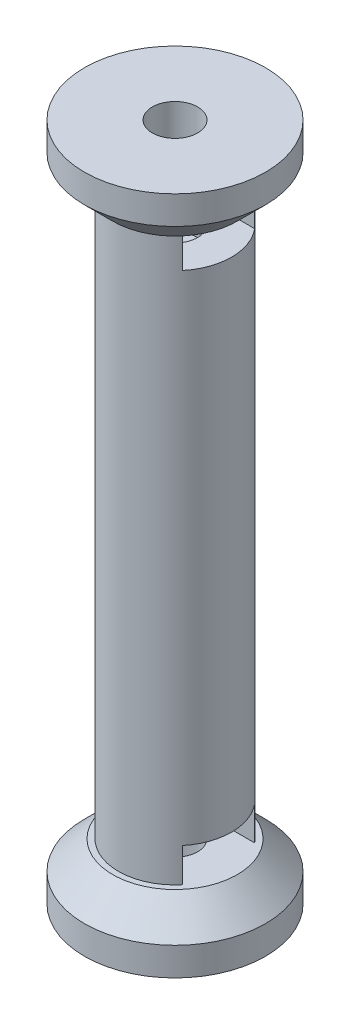
ISO-10303-21;
HEADER;
FILE_DESCRIPTION(('STEP AP214'),'2;1');
FILE_NAME('part.step','',(''),(''),'','','');
FILE_SCHEMA(('AUTOMOTIVE_DESIGN { 1 0 10303 214 1 1 1 1 }'));
ENDSEC;
DATA;
#1=APPLICATION_CONTEXT('core data for automotive mechanical design processes');
#2=APPLICATION_PROTOCOL_DEFINITION('international standard','automotive_design',2000,#1);
#3=PRODUCT_CONTEXT('',#1,'mechanical');
#4=PRODUCT('Part','Part','',(#3));
#5=PRODUCT_RELATED_PRODUCT_CATEGORY('part','',(#4));
#6=PRODUCT_DEFINITION_FORMATION('','',#4);
#7=PRODUCT_DEFINITION_CONTEXT('part definition',#1,'design');
#8=PRODUCT_DEFINITION('design','',#6,#7);
#9=PRODUCT_DEFINITION_SHAPE('','',#8);
#10=(LENGTH_UNIT() NAMED_UNIT(*) SI_UNIT(.MILLI.,.METRE.));
#11=(NAMED_UNIT(*) PLANE_ANGLE_UNIT() SI_UNIT($,.RADIAN.));
#12=(NAMED_UNIT(*) SI_UNIT($,.STERADIAN.) SOLID_ANGLE_UNIT());
#13=UNCERTAINTY_MEASURE_WITH_UNIT(LENGTH_MEASURE(1.E-05),#10,'distance_accuracy_value','');
#14=(GEOMETRIC_REPRESENTATION_CONTEXT(3) GLOBAL_UNCERTAINTY_ASSIGNED_CONTEXT((#13)) GLOBAL_UNIT_ASSIGNED_CONTEXT((#10,
#11,#12)) REPRESENTATION_CONTEXT('',''));
#15=CARTESIAN_POINT('',(0.,0.,0.));
#16=DIRECTION('',(0.,0.,1.));
#17=DIRECTION('',(1.,0.,0.));
#18=AXIS2_PLACEMENT_3D('',#15,#16,#17);
#19=CARTESIAN_POINT('',(0.,25.,0.));
#20=DIRECTION('',(0.,-1.,0.));
#21=DIRECTION('',(0.,0.,-1.));
#22=AXIS2_PLACEMENT_3D('',#19,#20,#21);
#23=CYLINDRICAL_SURFACE('',#22,5.);
#24=CARTESIAN_POINT('',(0.,-25.,0.));
#25=DIRECTION('',(0.,1.,0.));
#26=DIRECTION('',(0.,0.,1.));
#27=AXIS2_PLACEMENT_3D('',#24,#25,#26);
#28=CIRCLE('',#27,5.);
#29=CARTESIAN_POINT('',(3.84187454245971,-25.,-3.2));
#30=VERTEX_POINT('',#29);
#31=CARTESIAN_POINT('',(3.84187454245971,-25.,3.2));
#32=VERTEX_POINT('',#31);
#33=EDGE_CURVE('E153',#30,#32,#28,.T.);
#34=ORIENTED_EDGE('',*,*,#33,.T.);
#35=DIRECTION('',(0.,-1.,0.));
#36=VECTOR('',#35,1.);
#37=CARTESIAN_POINT('',(3.84187454245971,25.,3.2));
#38=LINE('',#37,#36);
#39=CARTESIAN_POINT('',(3.84187454245971,-22.,3.2));
#40=VERTEX_POINT('',#39);
#41=EDGE_CURVE('E156',#32,#40,#38,.F.);
#42=ORIENTED_EDGE('',*,*,#41,.T.);
#43=CARTESIAN_POINT('',(0.,-22.,0.));
#44=DIRECTION('',(0.,-1.,0.));
#45=DIRECTION('',(0.,0.,-1.));
#46=AXIS2_PLACEMENT_3D('',#43,#44,#45);
#47=CIRCLE('',#46,5.);
#48=CARTESIAN_POINT('',(3.84187454245971,-22.,-3.2));
#49=VERTEX_POINT('',#48);
#50=EDGE_CURVE('E154',#49,#40,#47,.T.);
#51=ORIENTED_EDGE('',*,*,#50,.F.);
#52=DIRECTION('',(0.,-1.,0.));
#53=VECTOR('',#52,1.);
#54=CARTESIAN_POINT('',(3.84187454245971,25.,-3.2));
#55=LINE('',#54,#53);
#56=EDGE_CURVE('E140',#49,#30,#55,.T.);
#57=ORIENTED_EDGE('',*,*,#56,.T.);
#58=EDGE_LOOP('',(#34,#42,#51,#57));
#59=FACE_BOUND('',#58,.T.);
#60=DIRECTION('',(0.,-1.,0.));
#61=VECTOR('',#60,1.);
#62=CARTESIAN_POINT('',(3.84187454245971,25.,-3.2));
#63=LINE('',#62,#61);
#64=CARTESIAN_POINT('',(3.84187454245971,22.,-3.2));
#65=VERTEX_POINT('',#64);
#66=CARTESIAN_POINT('',(3.84187454245971,25.,-3.2));
#67=VERTEX_POINT('',#66);
#68=EDGE_CURVE('E310',#65,#67,#63,.F.);
#69=ORIENTED_EDGE('',*,*,#68,.F.);
#70=CARTESIAN_POINT('',(0.,22.,0.));
#71=DIRECTION('',(0.,1.,0.));
#72=DIRECTION('',(0.,0.,1.));
#73=AXIS2_PLACEMENT_3D('',#70,#71,#72);
#74=CIRCLE('',#73,5.);
#75=CARTESIAN_POINT('',(3.84187454245971,22.,3.2));
#76=VERTEX_POINT('',#75);
#77=EDGE_CURVE('E196',#76,#65,#74,.T.);
#78=ORIENTED_EDGE('',*,*,#77,.F.);
#79=DIRECTION('',(0.,-1.,0.));
#80=VECTOR('',#79,1.);
#81=CARTESIAN_POINT('',(3.84187454245971,25.,3.2));
#82=LINE('',#81,#80);
#83=CARTESIAN_POINT('',(3.84187454245971,25.,3.2));
#84=VERTEX_POINT('',#83);
#85=EDGE_CURVE('E307',#84,#76,#82,.T.);
#86=ORIENTED_EDGE('',*,*,#85,.F.);
#87=CARTESIAN_POINT('',(0.,25.,0.));
#88=DIRECTION('',(0.,1.,0.));
#89=DIRECTION('',(0.,0.,1.));
#90=AXIS2_PLACEMENT_3D('',#87,#88,#89);
#91=CIRCLE('',#90,5.);
#92=EDGE_CURVE('E176',#67,#84,#91,.T.);
#93=ORIENTED_EDGE('',*,*,#92,.F.);
#94=EDGE_LOOP('',(#69,#78,#86,#93));
#95=FACE_BOUND('',#94,.T.);
#96=ADVANCED_FACE('F43',(#59,#95),#23,.T.);
#97=CARTESIAN_POINT('',(0.,30.,0.));
#98=DIRECTION('',(0.,-1.,0.));
#99=DIRECTION('',(0.,0.,-1.));
#100=AXIS2_PLACEMENT_3D('',#97,#98,#99);
#101=CYLINDRICAL_SURFACE('',#100,8.);
#102=CARTESIAN_POINT('',(0.,27.5,0.));
#103=DIRECTION('',(0.,1.,0.));
#104=DIRECTION('',(0.,0.,1.));
#105=AXIS2_PLACEMENT_3D('',#102,#103,#104);
#106=CIRCLE('',#105,8.);
#107=CARTESIAN_POINT('',(0.,27.5,8.));
#108=VERTEX_POINT('',#107);
#109=EDGE_CURVE('E178',#108,#108,#106,.T.);
#110=ORIENTED_EDGE('',*,*,#109,.T.);
#111=EDGE_LOOP('',(#110));
#112=FACE_BOUND('',#111,.T.);
#113=CARTESIAN_POINT('',(0.,30.,0.));
#114=DIRECTION('',(0.,1.,0.));
#115=DIRECTION('',(0.,0.,1.));
#116=AXIS2_PLACEMENT_3D('',#113,#114,#115);
#117=CIRCLE('',#116,8.);
#118=CARTESIAN_POINT('',(0.,30.,8.));
#119=VERTEX_POINT('',#118);
#120=EDGE_CURVE('E319',#119,#119,#117,.T.);
#121=ORIENTED_EDGE('',*,*,#120,.F.);
#122=EDGE_LOOP('',(#121));
#123=FACE_BOUND('',#122,.T.);
#124=ADVANCED_FACE('F372',(#112,#123),#101,.T.);
#125=CARTESIAN_POINT('',(0.,30.,0.));
#126=DIRECTION('',(0.,1.,0.));
#127=DIRECTION('',(0.,0.,1.));
#128=AXIS2_PLACEMENT_3D('',#125,#126,#127);
#129=PLANE('',#128);
#130=CARTESIAN_POINT('',(0.,30.,0.));
#131=DIRECTION('',(0.,1.,0.));
#132=DIRECTION('',(0.,0.,1.));
#133=AXIS2_PLACEMENT_3D('',#130,#131,#132);
#134=CIRCLE('',#133,2.);
#135=CARTESIAN_POINT('',(0.,30.,2.));
#136=VERTEX_POINT('',#135);
#137=EDGE_CURVE('E314',#136,#136,#134,.T.);
#138=ORIENTED_EDGE('',*,*,#137,.F.);
#139=EDGE_LOOP('',(#138));
#140=FACE_BOUND('',#139,.T.);
#141=ORIENTED_EDGE('',*,*,#120,.T.);
#142=EDGE_LOOP('',(#141));
#143=FACE_BOUND('',#142,.T.);
#144=ADVANCED_FACE('F377',(#140,#143),#129,.T.);
#145=CARTESIAN_POINT('',(0.,25.,0.));
#146=DIRECTION('',(0.,1.,0.));
#147=DIRECTION('',(0.,0.,1.));
#148=AXIS2_PLACEMENT_3D('',#145,#146,#147);
#149=PLANE('',#148);
#150=CARTESIAN_POINT('',(0.,25.,0.));
#151=DIRECTION('',(0.,1.,0.));
#152=DIRECTION('',(0.,0.,1.));
#153=AXIS2_PLACEMENT_3D('',#150,#151,#152);
#154=CIRCLE('',#153,5.49999999999998);
#155=CARTESIAN_POINT('',(0.,25.,5.49999999999998));
#156=VERTEX_POINT('',#155);
#157=EDGE_CURVE('E182',#156,#156,#154,.F.);
#158=ORIENTED_EDGE('',*,*,#157,.T.);
#159=EDGE_LOOP('',(#158));
#160=FACE_BOUND('',#159,.T.);
#161=DIRECTION('',(-1.,0.,0.));
#162=VECTOR('',#161,1.);
#163=CARTESIAN_POINT('',(-3.5,25.,3.2));
#164=LINE('',#163,#162);
#165=CARTESIAN_POINT('',(-2.49999999999999,25.,3.2));
#166=VERTEX_POINT('',#165);
#167=EDGE_CURVE('E293',#84,#166,#164,.T.);
#168=ORIENTED_EDGE('',*,*,#167,.T.);
#169=DIRECTION('',(0.707106781186552,0.,0.707106781186543));
#170=VECTOR('',#169,1.);
#171=CARTESIAN_POINT('',(-2.49999999999999,25.,3.2));
#172=LINE('',#171,#170);
#173=CARTESIAN_POINT('',(-3.5,25.,2.2));
#174=VERTEX_POINT('',#173);
#175=EDGE_CURVE('E203',#166,#174,#172,.F.);
#176=ORIENTED_EDGE('',*,*,#175,.T.);
#177=DIRECTION('',(0.,0.,-1.));
#178=VECTOR('',#177,1.);
#179=CARTESIAN_POINT('',(-3.5,25.,-3.2));
#180=LINE('',#179,#178);
#181=CARTESIAN_POINT('',(-3.5,25.,-2.19999999999999));
#182=VERTEX_POINT('',#181);
#183=EDGE_CURVE('E163',#174,#182,#180,.T.);
#184=ORIENTED_EDGE('',*,*,#183,.T.);
#185=DIRECTION('',(-0.707106781186545,0.,0.70710678118655));
#186=VECTOR('',#185,1.);
#187=CARTESIAN_POINT('',(-3.5,25.,-2.19999999999999));
#188=LINE('',#187,#186);
#189=CARTESIAN_POINT('',(-2.5,25.,-3.2));
#190=VERTEX_POINT('',#189);
#191=EDGE_CURVE('E200',#182,#190,#188,.F.);
#192=ORIENTED_EDGE('',*,*,#191,.T.);
#193=DIRECTION('',(1.,0.,0.));
#194=VECTOR('',#193,1.);
#195=CARTESIAN_POINT('',(-3.5,25.,-3.2));
#196=LINE('',#195,#194);
#197=EDGE_CURVE('E169',#190,#67,#196,.T.);
#198=ORIENTED_EDGE('',*,*,#197,.T.);
#199=ORIENTED_EDGE('',*,*,#92,.T.);
#200=EDGE_LOOP('',(#168,#176,#184,#192,#198,#199));
#201=FACE_BOUND('',#200,.T.);
#202=CARTESIAN_POINT('',(0.,25.,0.));
#203=DIRECTION('',(0.,1.,0.));
#204=DIRECTION('',(0.,0.,1.));
#205=AXIS2_PLACEMENT_3D('',#202,#203,#204);
#206=CIRCLE('',#205,2.);
#207=CARTESIAN_POINT('',(0.,25.,2.));
#208=VERTEX_POINT('',#207);
#209=EDGE_CURVE('E187',#208,#208,#206,.F.);
#210=ORIENTED_EDGE('',*,*,#209,.F.);
#211=EDGE_LOOP('',(#210));
#212=FACE_BOUND('',#211,.T.);
#213=ADVANCED_FACE('F330',(#160,#201,#212),#149,.F.);
#214=CARTESIAN_POINT('',(0.,27.5,0.));
#215=DIRECTION('',(0.,1.,0.));
#216=DIRECTION('',(0.,0.,1.));
#217=AXIS2_PLACEMENT_3D('',#214,#215,#216);
#218=CONICAL_SURFACE('',#217,8.,0.785398163397452);
#219=ORIENTED_EDGE('',*,*,#157,.F.);
#220=EDGE_LOOP('',(#219));
#221=FACE_BOUND('',#220,.T.);
#222=ORIENTED_EDGE('',*,*,#109,.F.);
#223=EDGE_LOOP('',(#222));
#224=FACE_BOUND('',#223,.T.);
#225=ADVANCED_FACE('F366',(#221,#224),#218,.T.);
#226=CARTESIAN_POINT('',(0.,20.,0.));
#227=DIRECTION('',(0.,1.,0.));
#228=DIRECTION('',(0.,0.,1.));
#229=AXIS2_PLACEMENT_3D('',#226,#227,#228);
#230=CYLINDRICAL_SURFACE('',#229,2.);
#231=ORIENTED_EDGE('',*,*,#209,.T.);
#232=EDGE_LOOP('',(#231));
#233=FACE_BOUND('',#232,.T.);
#234=ORIENTED_EDGE('',*,*,#137,.T.);
#235=EDGE_LOOP('',(#234));
#236=FACE_BOUND('',#235,.T.);
#237=ADVANCED_FACE('F359',(#233,#236),#230,.F.);
#238=CARTESIAN_POINT('',(-3.5,22.,-3.2));
#239=DIRECTION('',(0.,0.,1.));
#240=DIRECTION('',(1.,0.,0.));
#241=AXIS2_PLACEMENT_3D('',#238,#239,#240);
#242=PLANE('',#241);
#243=ORIENTED_EDGE('',*,*,#197,.F.);
#244=DIRECTION('',(0.,-1.,0.));
#245=VECTOR('',#244,1.);
#246=CARTESIAN_POINT('',(-2.5,22.,-3.2));
#247=LINE('',#246,#245);
#248=CARTESIAN_POINT('',(-2.5,22.,-3.2));
#249=VERTEX_POINT('',#248);
#250=EDGE_CURVE('E219',#190,#249,#247,.T.);
#251=ORIENTED_EDGE('',*,*,#250,.T.);
#252=DIRECTION('',(1.,0.,0.));
#253=VECTOR('',#252,1.);
#254=CARTESIAN_POINT('',(-3.5,22.,-3.2));
#255=LINE('',#254,#253);
#256=EDGE_CURVE('E292',#249,#65,#255,.T.);
#257=ORIENTED_EDGE('',*,*,#256,.T.);
#258=ORIENTED_EDGE('',*,*,#68,.T.);
#259=EDGE_LOOP('',(#243,#251,#257,#258));
#260=FACE_BOUND('',#259,.T.);
#261=ADVANCED_FACE('F357',(#260),#242,.T.);
#262=CARTESIAN_POINT('',(-3.5,22.,3.2));
#263=DIRECTION('',(0.,0.,-1.));
#264=DIRECTION('',(-1.,0.,0.));
#265=AXIS2_PLACEMENT_3D('',#262,#263,#264);
#266=PLANE('',#265);
#267=DIRECTION('',(-1.,0.,0.));
#268=VECTOR('',#267,1.);
#269=CARTESIAN_POINT('',(-3.5,22.,3.2));
#270=LINE('',#269,#268);
#271=CARTESIAN_POINT('',(-2.49999999999999,22.,3.2));
#272=VERTEX_POINT('',#271);
#273=EDGE_CURVE('E192',#76,#272,#270,.T.);
#274=ORIENTED_EDGE('',*,*,#273,.T.);
#275=DIRECTION('',(0.,1.,0.));
#276=VECTOR('',#275,1.);
#277=CARTESIAN_POINT('',(-2.49999999999999,25.,3.2));
#278=LINE('',#277,#276);
#279=EDGE_CURVE('E186',#272,#166,#278,.T.);
#280=ORIENTED_EDGE('',*,*,#279,.T.);
#281=ORIENTED_EDGE('',*,*,#167,.F.);
#282=ORIENTED_EDGE('',*,*,#85,.T.);
#283=EDGE_LOOP('',(#274,#280,#281,#282));
#284=FACE_BOUND('',#283,.T.);
#285=ADVANCED_FACE('F338',(#284),#266,.T.);
#286=CARTESIAN_POINT('',(0.,22.,0.));
#287=DIRECTION('',(0.,1.,0.));
#288=DIRECTION('',(0.,0.,1.));
#289=AXIS2_PLACEMENT_3D('',#286,#287,#288);
#290=PLANE('',#289);
#291=CARTESIAN_POINT('',(0.,22.,0.));
#292=DIRECTION('',(0.,1.,0.));
#293=DIRECTION('',(0.,0.,1.));
#294=AXIS2_PLACEMENT_3D('',#291,#292,#293);
#295=CIRCLE('',#294,2.);
#296=CARTESIAN_POINT('',(0.,22.,2.));
#297=VERTEX_POINT('',#296);
#298=EDGE_CURVE('E191',#297,#297,#295,.F.);
#299=ORIENTED_EDGE('',*,*,#298,.T.);
#300=EDGE_LOOP('',(#299));
#301=FACE_BOUND('',#300,.T.);
#302=DIRECTION('',(0.,0.,-1.));
#303=VECTOR('',#302,1.);
#304=CARTESIAN_POINT('',(-3.5,22.,-3.2));
#305=LINE('',#304,#303);
#306=CARTESIAN_POINT('',(-3.5,22.,2.2));
#307=VERTEX_POINT('',#306);
#308=CARTESIAN_POINT('',(-3.5,22.,-2.19999999999999));
#309=VERTEX_POINT('',#308);
#310=EDGE_CURVE('E288',#307,#309,#305,.T.);
#311=ORIENTED_EDGE('',*,*,#310,.F.);
#312=DIRECTION('',(-0.707106781186552,0.,-0.707106781186543));
#313=VECTOR('',#312,1.);
#314=CARTESIAN_POINT('',(-2.84999999999998,22.,2.85000000000002));
#315=LINE('',#314,#313);
#316=EDGE_CURVE('E216',#307,#272,#315,.F.);
#317=ORIENTED_EDGE('',*,*,#316,.T.);
#318=ORIENTED_EDGE('',*,*,#273,.F.);
#319=ORIENTED_EDGE('',*,*,#77,.T.);
#320=ORIENTED_EDGE('',*,*,#256,.F.);
#321=DIRECTION('',(0.707106781186545,0.,-0.70710678118655));
#322=VECTOR('',#321,1.);
#323=CARTESIAN_POINT('',(-2.85000000000001,22.,-2.84999999999999));
#324=LINE('',#323,#322);
#325=EDGE_CURVE('E213',#249,#309,#324,.F.);
#326=ORIENTED_EDGE('',*,*,#325,.T.);
#327=EDGE_LOOP('',(#311,#317,#318,#319,#320,#326));
#328=FACE_BOUND('',#327,.T.);
#329=ADVANCED_FACE('F342',(#301,#328),#290,.T.);
#330=CARTESIAN_POINT('',(-3.5,22.,-3.2));
#331=DIRECTION('',(1.,0.,0.));
#332=DIRECTION('',(0.,0.,-1.));
#333=AXIS2_PLACEMENT_3D('',#330,#331,#332);
#334=PLANE('',#333);
#335=ORIENTED_EDGE('',*,*,#183,.F.);
#336=DIRECTION('',(0.,-1.,0.));
#337=VECTOR('',#336,1.);
#338=CARTESIAN_POINT('',(-3.5,22.,2.2));
#339=LINE('',#338,#337);
#340=EDGE_CURVE('E210',#174,#307,#339,.T.);
#341=ORIENTED_EDGE('',*,*,#340,.T.);
#342=ORIENTED_EDGE('',*,*,#310,.T.);
#343=DIRECTION('',(0.,1.,0.));
#344=VECTOR('',#343,1.);
#345=CARTESIAN_POINT('',(-3.5,25.,-2.19999999999999));
#346=LINE('',#345,#344);
#347=EDGE_CURVE('E206',#309,#182,#346,.T.);
#348=ORIENTED_EDGE('',*,*,#347,.T.);
#349=EDGE_LOOP('',(#335,#341,#342,#348));
#350=FACE_BOUND('',#349,.T.);
#351=ADVANCED_FACE('F350',(#350),#334,.T.);
#352=CARTESIAN_POINT('',(0.,20.,0.));
#353=DIRECTION('',(0.,1.,0.));
#354=DIRECTION('',(0.,0.,1.));
#355=AXIS2_PLACEMENT_3D('',#352,#353,#354);
#356=PLANE('',#355);
#357=CARTESIAN_POINT('',(0.,20.,0.));
#358=DIRECTION('',(0.,1.,0.));
#359=DIRECTION('',(0.,0.,1.));
#360=AXIS2_PLACEMENT_3D('',#357,#358,#359);
#361=CIRCLE('',#360,2.);
#362=CARTESIAN_POINT('',(0.,20.,2.));
#363=VERTEX_POINT('',#362);
#364=EDGE_CURVE('E315',#363,#363,#361,.T.);
#365=ORIENTED_EDGE('',*,*,#364,.T.);
#366=EDGE_LOOP('',(#365));
#367=FACE_BOUND('',#366,.T.);
#368=ADVANCED_FACE('F453',(#367),#356,.T.);
#369=ORIENTED_EDGE('',*,*,#364,.F.);
#370=EDGE_LOOP('',(#369));
#371=FACE_BOUND('',#370,.T.);
#372=ORIENTED_EDGE('',*,*,#298,.F.);
#373=EDGE_LOOP('',(#372));
#374=FACE_BOUND('',#373,.T.);
#375=ADVANCED_FACE('F369',(#371,#374),#230,.F.);
#376=CARTESIAN_POINT('',(-2.49999999999999,22.,3.2));
#377=DIRECTION('',(0.707106781186543,0.,-0.707106781186552));
#378=DIRECTION('',(0.,-1.,0.));
#379=AXIS2_PLACEMENT_3D('',#376,#377,#378);
#380=PLANE('',#379);
#381=ORIENTED_EDGE('',*,*,#316,.F.);
#382=ORIENTED_EDGE('',*,*,#340,.F.);
#383=ORIENTED_EDGE('',*,*,#175,.F.);
#384=ORIENTED_EDGE('',*,*,#279,.F.);
#385=EDGE_LOOP('',(#381,#382,#383,#384));
#386=FACE_BOUND('',#385,.T.);
#387=ADVANCED_FACE('F347',(#386),#380,.T.);
#388=CARTESIAN_POINT('',(-3.5,22.,-2.19999999999999));
#389=DIRECTION('',(0.70710678118655,0.,0.707106781186545));
#390=DIRECTION('',(0.,-1.,0.));
#391=AXIS2_PLACEMENT_3D('',#388,#389,#390);
#392=PLANE('',#391);
#393=ORIENTED_EDGE('',*,*,#325,.F.);
#394=ORIENTED_EDGE('',*,*,#250,.F.);
#395=ORIENTED_EDGE('',*,*,#191,.F.);
#396=ORIENTED_EDGE('',*,*,#347,.F.);
#397=EDGE_LOOP('',(#393,#394,#395,#396));
#398=FACE_BOUND('',#397,.T.);
#399=ADVANCED_FACE('F354',(#398),#392,.T.);
#400=CARTESIAN_POINT('',(0.,-30.,0.));
#401=DIRECTION('',(0.,1.,0.));
#402=DIRECTION('',(0.,0.,1.));
#403=AXIS2_PLACEMENT_3D('',#400,#401,#402);
#404=CYLINDRICAL_SURFACE('',#403,8.);
#405=CARTESIAN_POINT('',(0.,-27.5,0.));
#406=DIRECTION('',(0.,-1.,0.));
#407=DIRECTION('',(0.,0.,-1.));
#408=AXIS2_PLACEMENT_3D('',#405,#406,#407);
#409=CIRCLE('',#408,8.);
#410=CARTESIAN_POINT('',(0.,-27.5,-8.));
#411=VERTEX_POINT('',#410);
#412=EDGE_CURVE('E226',#411,#411,#409,.T.);
#413=ORIENTED_EDGE('',*,*,#412,.T.);
#414=EDGE_LOOP('',(#413));
#415=FACE_BOUND('',#414,.T.);
#416=CARTESIAN_POINT('',(0.,-30.,0.));
#417=DIRECTION('',(0.,1.,0.));
#418=DIRECTION('',(0.,0.,1.));
#419=AXIS2_PLACEMENT_3D('',#416,#417,#418);
#420=CIRCLE('',#419,8.);
#421=CARTESIAN_POINT('',(0.,-30.,8.));
#422=VERTEX_POINT('',#421);
#423=EDGE_CURVE('E164',#422,#422,#420,.T.);
#424=ORIENTED_EDGE('',*,*,#423,.T.);
#425=EDGE_LOOP('',(#424));
#426=FACE_BOUND('',#425,.T.);
#427=ADVANCED_FACE('F399',(#415,#426),#404,.T.);
#428=CARTESIAN_POINT('',(0.,-30.,0.));
#429=DIRECTION('',(0.,-1.,0.));
#430=DIRECTION('',(0.,0.,1.));
#431=AXIS2_PLACEMENT_3D('',#428,#429,#430);
#432=PLANE('',#431);
#433=CARTESIAN_POINT('',(0.,-30.,0.));
#434=DIRECTION('',(0.,1.,0.));
#435=DIRECTION('',(0.,0.,1.));
#436=AXIS2_PLACEMENT_3D('',#433,#434,#435);
#437=CIRCLE('',#436,2.);
#438=CARTESIAN_POINT('',(0.,-30.,2.));
#439=VERTEX_POINT('',#438);
#440=EDGE_CURVE('E281',#439,#439,#437,.T.);
#441=ORIENTED_EDGE('',*,*,#440,.T.);
#442=EDGE_LOOP('',(#441));
#443=FACE_BOUND('',#442,.T.);
#444=ORIENTED_EDGE('',*,*,#423,.F.);
#445=EDGE_LOOP('',(#444));
#446=FACE_BOUND('',#445,.T.);
#447=ADVANCED_FACE('F436',(#443,#446),#432,.T.);
#448=CARTESIAN_POINT('',(0.,-25.,0.));
#449=DIRECTION('',(0.,-1.,0.));
#450=DIRECTION('',(0.,0.,1.));
#451=AXIS2_PLACEMENT_3D('',#448,#449,#450);
#452=PLANE('',#451);
#453=DIRECTION('',(0.,0.,-1.));
#454=VECTOR('',#453,1.);
#455=CARTESIAN_POINT('',(-3.5,-25.,-3.2));
#456=LINE('',#455,#454);
#457=CARTESIAN_POINT('',(-3.5,-25.,2.2));
#458=VERTEX_POINT('',#457);
#459=CARTESIAN_POINT('',(-3.5,-25.,-2.19999999999999));
#460=VERTEX_POINT('',#459);
#461=EDGE_CURVE('E269',#458,#460,#456,.T.);
#462=ORIENTED_EDGE('',*,*,#461,.F.);
#463=DIRECTION('',(-0.70710678118655,0.,-0.707106781186545));
#464=VECTOR('',#463,1.);
#465=CARTESIAN_POINT('',(-3.5,-25.,2.2));
#466=LINE('',#465,#464);
#467=CARTESIAN_POINT('',(-2.49999999999999,-25.,3.2));
#468=VERTEX_POINT('',#467);
#469=EDGE_CURVE('E249',#458,#468,#466,.F.);
#470=ORIENTED_EDGE('',*,*,#469,.T.);
#471=DIRECTION('',(-1.,0.,0.));
#472=VECTOR('',#471,1.);
#473=CARTESIAN_POINT('',(-3.5,-25.,3.2));
#474=LINE('',#473,#472);
#475=EDGE_CURVE('E147',#32,#468,#474,.T.);
#476=ORIENTED_EDGE('',*,*,#475,.F.);
#477=ORIENTED_EDGE('',*,*,#33,.F.);
#478=DIRECTION('',(1.,0.,0.));
#479=VECTOR('',#478,1.);
#480=CARTESIAN_POINT('',(-3.5,-25.,-3.2));
#481=LINE('',#480,#479);
#482=CARTESIAN_POINT('',(-2.5,-25.,-3.2));
#483=VERTEX_POINT('',#482);
#484=EDGE_CURVE('E137',#483,#30,#481,.T.);
#485=ORIENTED_EDGE('',*,*,#484,.F.);
#486=DIRECTION('',(0.707106781186545,0.,-0.70710678118655));
#487=VECTOR('',#486,1.);
#488=CARTESIAN_POINT('',(-2.5,-25.,-3.2));
#489=LINE('',#488,#487);
#490=EDGE_CURVE('E246',#483,#460,#489,.F.);
#491=ORIENTED_EDGE('',*,*,#490,.T.);
#492=EDGE_LOOP('',(#462,#470,#476,#477,#485,#491));
#493=FACE_BOUND('',#492,.T.);
#494=CARTESIAN_POINT('',(0.,-25.,0.));
#495=DIRECTION('',(0.,-1.,0.));
#496=DIRECTION('',(0.,0.,-1.));
#497=AXIS2_PLACEMENT_3D('',#494,#495,#496);
#498=CIRCLE('',#497,5.49999999999996);
#499=CARTESIAN_POINT('',(0.,-25.,-5.49999999999996));
#500=VERTEX_POINT('',#499);
#501=EDGE_CURVE('E222',#500,#500,#498,.F.);
#502=ORIENTED_EDGE('',*,*,#501,.T.);
#503=EDGE_LOOP('',(#502));
#504=FACE_BOUND('',#503,.T.);
#505=CARTESIAN_POINT('',(0.,-25.,0.));
#506=DIRECTION('',(0.,-1.,0.));
#507=DIRECTION('',(0.,0.,-1.));
#508=AXIS2_PLACEMENT_3D('',#505,#506,#507);
#509=CIRCLE('',#508,2.);
#510=CARTESIAN_POINT('',(0.,-25.,-2.));
#511=VERTEX_POINT('',#510);
#512=EDGE_CURVE('E231',#511,#511,#509,.T.);
#513=ORIENTED_EDGE('',*,*,#512,.T.);
#514=EDGE_LOOP('',(#513));
#515=FACE_BOUND('',#514,.T.);
#516=ADVANCED_FACE('F159',(#493,#504,#515),#452,.F.);
#517=CARTESIAN_POINT('',(0.,-25.,0.));
#518=DIRECTION('',(0.,-1.,0.));
#519=DIRECTION('',(0.,0.,-1.));
#520=AXIS2_PLACEMENT_3D('',#517,#518,#519);
#521=CONICAL_SURFACE('',#520,5.49999999999996,0.785398163397454);
#522=ORIENTED_EDGE('',*,*,#412,.F.);
#523=EDGE_LOOP('',(#522));
#524=FACE_BOUND('',#523,.T.);
#525=ORIENTED_EDGE('',*,*,#501,.F.);
#526=EDGE_LOOP('',(#525));
#527=FACE_BOUND('',#526,.T.);
#528=ADVANCED_FACE('F400',(#524,#527),#521,.T.);
#529=CARTESIAN_POINT('',(0.,-20.,0.));
#530=DIRECTION('',(0.,-1.,0.));
#531=DIRECTION('',(0.,0.,-1.));
#532=AXIS2_PLACEMENT_3D('',#529,#530,#531);
#533=CYLINDRICAL_SURFACE('',#532,2.);
#534=ORIENTED_EDGE('',*,*,#512,.F.);
#535=EDGE_LOOP('',(#534));
#536=FACE_BOUND('',#535,.T.);
#537=ORIENTED_EDGE('',*,*,#440,.F.);
#538=EDGE_LOOP('',(#537));
#539=FACE_BOUND('',#538,.T.);
#540=ADVANCED_FACE('F405',(#536,#539),#533,.F.);
#541=CARTESIAN_POINT('',(-3.5,-22.,3.2));
#542=DIRECTION('',(0.,0.,1.));
#543=DIRECTION('',(1.,0.,0.));
#544=AXIS2_PLACEMENT_3D('',#541,#542,#543);
#545=PLANE('',#544);
#546=ORIENTED_EDGE('',*,*,#475,.T.);
#547=DIRECTION('',(0.,1.,0.));
#548=VECTOR('',#547,1.);
#549=CARTESIAN_POINT('',(-2.49999999999999,-22.,3.2));
#550=LINE('',#549,#548);
#551=CARTESIAN_POINT('',(-2.49999999999999,-22.,3.2));
#552=VERTEX_POINT('',#551);
#553=EDGE_CURVE('E68',#468,#552,#550,.T.);
#554=ORIENTED_EDGE('',*,*,#553,.T.);
#555=DIRECTION('',(-1.,0.,0.));
#556=VECTOR('',#555,1.);
#557=CARTESIAN_POINT('',(-3.5,-22.,3.2));
#558=LINE('',#557,#556);
#559=EDGE_CURVE('E259',#40,#552,#558,.T.);
#560=ORIENTED_EDGE('',*,*,#559,.F.);
#561=ORIENTED_EDGE('',*,*,#41,.F.);
#562=EDGE_LOOP('',(#546,#554,#560,#561));
#563=FACE_BOUND('',#562,.T.);
#564=ADVANCED_FACE('F270',(#563),#545,.F.);
#565=CARTESIAN_POINT('',(-3.5,-22.,-3.2));
#566=DIRECTION('',(0.,0.,-1.));
#567=DIRECTION('',(-1.,0.,0.));
#568=AXIS2_PLACEMENT_3D('',#565,#566,#567);
#569=PLANE('',#568);
#570=DIRECTION('',(1.,0.,0.));
#571=VECTOR('',#570,1.);
#572=CARTESIAN_POINT('',(-3.5,-22.,-3.2));
#573=LINE('',#572,#571);
#574=CARTESIAN_POINT('',(-2.5,-22.,-3.2));
#575=VERTEX_POINT('',#574);
#576=EDGE_CURVE('E236',#575,#49,#573,.T.);
#577=ORIENTED_EDGE('',*,*,#576,.F.);
#578=DIRECTION('',(0.,-1.,0.));
#579=VECTOR('',#578,1.);
#580=CARTESIAN_POINT('',(-2.5,-25.,-3.2));
#581=LINE('',#580,#579);
#582=EDGE_CURVE('E11',#575,#483,#581,.T.);
#583=ORIENTED_EDGE('',*,*,#582,.T.);
#584=ORIENTED_EDGE('',*,*,#484,.T.);
#585=ORIENTED_EDGE('',*,*,#56,.F.);
#586=EDGE_LOOP('',(#577,#583,#584,#585));
#587=FACE_BOUND('',#586,.T.);
#588=ADVANCED_FACE('F139',(#587),#569,.F.);
#589=CARTESIAN_POINT('',(0.,-22.,0.));
#590=DIRECTION('',(0.,-1.,0.));
#591=DIRECTION('',(0.,0.,1.));
#592=AXIS2_PLACEMENT_3D('',#589,#590,#591);
#593=PLANE('',#592);
#594=CARTESIAN_POINT('',(0.,-22.,0.));
#595=DIRECTION('',(0.,-1.,0.));
#596=DIRECTION('',(0.,0.,-1.));
#597=AXIS2_PLACEMENT_3D('',#594,#595,#596);
#598=CIRCLE('',#597,2.);
#599=CARTESIAN_POINT('',(0.,-22.,-2.));
#600=VERTEX_POINT('',#599);
#601=EDGE_CURVE('E235',#600,#600,#598,.T.);
#602=ORIENTED_EDGE('',*,*,#601,.F.);
#603=EDGE_LOOP('',(#602));
#604=FACE_BOUND('',#603,.T.);
#605=ORIENTED_EDGE('',*,*,#559,.T.);
#606=DIRECTION('',(0.70710678118655,0.,0.707106781186545));
#607=VECTOR('',#606,1.);
#608=CARTESIAN_POINT('',(-2.84999999999999,-22.,2.85000000000001));
#609=LINE('',#608,#607);
#610=CARTESIAN_POINT('',(-3.5,-22.,2.2));
#611=VERTEX_POINT('',#610);
#612=EDGE_CURVE('E53',#552,#611,#609,.F.);
#613=ORIENTED_EDGE('',*,*,#612,.T.);
#614=DIRECTION('',(0.,0.,-1.));
#615=VECTOR('',#614,1.);
#616=CARTESIAN_POINT('',(-3.5,-22.,-3.2));
#617=LINE('',#616,#615);
#618=CARTESIAN_POINT('',(-3.5,-22.,-2.19999999999999));
#619=VERTEX_POINT('',#618);
#620=EDGE_CURVE('E146',#611,#619,#617,.T.);
#621=ORIENTED_EDGE('',*,*,#620,.T.);
#622=DIRECTION('',(-0.707106781186545,0.,0.70710678118655));
#623=VECTOR('',#622,1.);
#624=CARTESIAN_POINT('',(-2.85000000000001,-22.,-2.84999999999999));
#625=LINE('',#624,#623);
#626=EDGE_CURVE('E60',#619,#575,#625,.F.);
#627=ORIENTED_EDGE('',*,*,#626,.T.);
#628=ORIENTED_EDGE('',*,*,#576,.T.);
#629=ORIENTED_EDGE('',*,*,#50,.T.);
#630=EDGE_LOOP('',(#605,#613,#621,#627,#628,#629));
#631=FACE_BOUND('',#630,.T.);
#632=ADVANCED_FACE('F258',(#604,#631),#593,.T.);
#633=CARTESIAN_POINT('',(-3.5,-22.,-3.2));
#634=DIRECTION('',(-1.,0.,0.));
#635=DIRECTION('',(0.,0.,1.));
#636=AXIS2_PLACEMENT_3D('',#633,#634,#635);
#637=PLANE('',#636);
#638=ORIENTED_EDGE('',*,*,#620,.F.);
#639=DIRECTION('',(0.,-1.,0.));
#640=VECTOR('',#639,1.);
#641=CARTESIAN_POINT('',(-3.5,-25.,2.2));
#642=LINE('',#641,#640);
#643=EDGE_CURVE('E242',#611,#458,#642,.T.);
#644=ORIENTED_EDGE('',*,*,#643,.T.);
#645=ORIENTED_EDGE('',*,*,#461,.T.);
#646=DIRECTION('',(0.,1.,0.));
#647=VECTOR('',#646,1.);
#648=CARTESIAN_POINT('',(-3.5,-22.,-2.19999999999999));
#649=LINE('',#648,#647);
#650=EDGE_CURVE('E230',#460,#619,#649,.T.);
#651=ORIENTED_EDGE('',*,*,#650,.T.);
#652=EDGE_LOOP('',(#638,#644,#645,#651));
#653=FACE_BOUND('',#652,.T.);
#654=ADVANCED_FACE('F263',(#653),#637,.F.);
#655=CARTESIAN_POINT('',(0.,-20.,0.));
#656=DIRECTION('',(0.,-1.,0.));
#657=DIRECTION('',(0.,0.,1.));
#658=AXIS2_PLACEMENT_3D('',#655,#656,#657);
#659=PLANE('',#658);
#660=CARTESIAN_POINT('',(0.,-20.,0.));
#661=DIRECTION('',(0.,1.,0.));
#662=DIRECTION('',(0.,0.,1.));
#663=AXIS2_PLACEMENT_3D('',#660,#661,#662);
#664=CIRCLE('',#663,2.);
#665=CARTESIAN_POINT('',(0.,-20.,2.));
#666=VERTEX_POINT('',#665);
#667=EDGE_CURVE('E172',#666,#666,#664,.T.);
#668=ORIENTED_EDGE('',*,*,#667,.F.);
#669=EDGE_LOOP('',(#668));
#670=FACE_BOUND('',#669,.T.);
#671=ADVANCED_FACE('F416',(#670),#659,.T.);
#672=ORIENTED_EDGE('',*,*,#667,.T.);
#673=EDGE_LOOP('',(#672));
#674=FACE_BOUND('',#673,.T.);
#675=ORIENTED_EDGE('',*,*,#601,.T.);
#676=EDGE_LOOP('',(#675));
#677=FACE_BOUND('',#676,.T.);
#678=ADVANCED_FACE('F410',(#674,#677),#533,.F.);
#679=CARTESIAN_POINT('',(-3.5,-22.,2.2));
#680=DIRECTION('',(0.707106781186545,0.,-0.70710678118655));
#681=DIRECTION('',(0.,1.,0.));
#682=AXIS2_PLACEMENT_3D('',#679,#680,#681);
#683=PLANE('',#682);
#684=ORIENTED_EDGE('',*,*,#612,.F.);
#685=ORIENTED_EDGE('',*,*,#553,.F.);
#686=ORIENTED_EDGE('',*,*,#469,.F.);
#687=ORIENTED_EDGE('',*,*,#643,.F.);
#688=EDGE_LOOP('',(#684,#685,#686,#687));
#689=FACE_BOUND('',#688,.T.);
#690=ADVANCED_FACE('F268',(#689),#683,.T.);
#691=CARTESIAN_POINT('',(-2.5,-22.,-3.2));
#692=DIRECTION('',(0.70710678118655,0.,0.707106781186545));
#693=DIRECTION('',(0.,1.,0.));
#694=AXIS2_PLACEMENT_3D('',#691,#692,#693);
#695=PLANE('',#694);
#696=ORIENTED_EDGE('',*,*,#626,.F.);
#697=ORIENTED_EDGE('',*,*,#650,.F.);
#698=ORIENTED_EDGE('',*,*,#490,.F.);
#699=ORIENTED_EDGE('',*,*,#582,.F.);
#700=EDGE_LOOP('',(#696,#697,#698,#699));
#701=FACE_BOUND('',#700,.T.);
#702=ADVANCED_FACE('F46',(#701),#695,.T.);
#703=CLOSED_SHELL('',(#96,#124,#144,#213,#225,#237,#261,#285,#329,#351,#368,#375,#387,#399,#427,
#447,#516,#528,#540,#564,#588,#632,#654,#671,#678,#690,#702));
#704=MANIFOLD_SOLID_BREP('B2',#703);
#705=ADVANCED_BREP_SHAPE_REPRESENTATION('',(#18,#704),#14);
#706=SHAPE_DEFINITION_REPRESENTATION(#9,#705);
ENDSEC;
END-ISO-10303-21;
